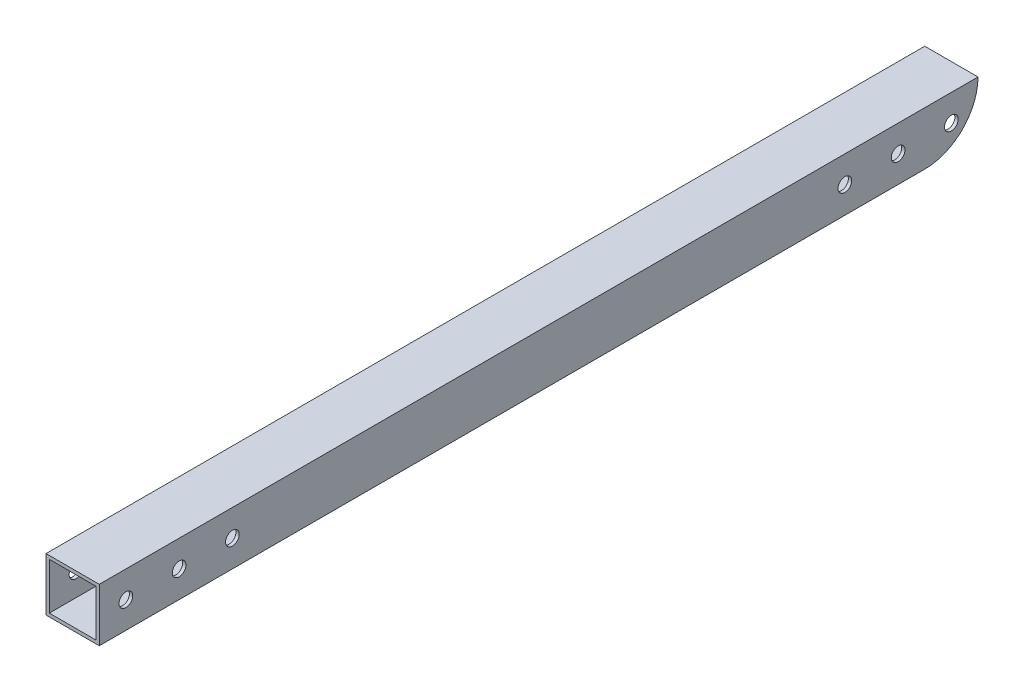
ISO-10303-21;
HEADER;
FILE_DESCRIPTION(('STEP AP214'),'2;1');
FILE_NAME('part.step','',(''),(''),'','','');
FILE_SCHEMA(('AUTOMOTIVE_DESIGN { 1 0 10303 214 1 1 1 1 }'));
ENDSEC;
DATA;
#1=APPLICATION_CONTEXT('core data for automotive mechanical design processes');
#2=APPLICATION_PROTOCOL_DEFINITION('international standard','automotive_design',2000,#1);
#3=PRODUCT_CONTEXT('',#1,'mechanical');
#4=PRODUCT('Part','Part','',(#3));
#5=PRODUCT_RELATED_PRODUCT_CATEGORY('part','',(#4));
#6=PRODUCT_DEFINITION_FORMATION('','',#4);
#7=PRODUCT_DEFINITION_CONTEXT('part definition',#1,'design');
#8=PRODUCT_DEFINITION('design','',#6,#7);
#9=PRODUCT_DEFINITION_SHAPE('','',#8);
#10=(LENGTH_UNIT() NAMED_UNIT(*) SI_UNIT(.MILLI.,.METRE.));
#11=(NAMED_UNIT(*) PLANE_ANGLE_UNIT() SI_UNIT($,.RADIAN.));
#12=(NAMED_UNIT(*) SI_UNIT($,.STERADIAN.) SOLID_ANGLE_UNIT());
#13=UNCERTAINTY_MEASURE_WITH_UNIT(LENGTH_MEASURE(1.E-05),#10,'distance_accuracy_value','');
#14=(GEOMETRIC_REPRESENTATION_CONTEXT(3) GLOBAL_UNCERTAINTY_ASSIGNED_CONTEXT((#13)) GLOBAL_UNIT_ASSIGNED_CONTEXT((#10,
#11,#12)) REPRESENTATION_CONTEXT('',''));
#15=CARTESIAN_POINT('',(0.,0.,0.));
#16=DIRECTION('',(0.,0.,1.));
#17=DIRECTION('',(1.,0.,0.));
#18=AXIS2_PLACEMENT_3D('',#15,#16,#17);
#19=CARTESIAN_POINT('',(0.,0.,419.1));
#20=DIRECTION('',(0.,1.,0.));
#21=DIRECTION('',(0.,0.,1.));
#22=AXIS2_PLACEMENT_3D('',#19,#20,#21);
#23=PLANE('',#22);
#24=DIRECTION('',(1.,0.,0.));
#25=VECTOR('',#24,1.);
#26=CARTESIAN_POINT('',(0.,0.,25.4));
#27=LINE('',#26,#25);
#28=CARTESIAN_POINT('',(0.,0.,25.4));
#29=VERTEX_POINT('',#28);
#30=CARTESIAN_POINT('',(25.4,0.,25.4));
#31=VERTEX_POINT('',#30);
#32=EDGE_CURVE('E96',#29,#31,#27,.T.);
#33=ORIENTED_EDGE('',*,*,#32,.T.);
#34=DIRECTION('',(0.,0.,-1.));
#35=VECTOR('',#34,1.);
#36=CARTESIAN_POINT('',(25.4,0.,419.1));
#37=LINE('',#36,#35);
#38=CARTESIAN_POINT('',(25.4,0.,419.1));
#39=VERTEX_POINT('',#38);
#40=EDGE_CURVE('E117',#39,#31,#37,.T.);
#41=ORIENTED_EDGE('',*,*,#40,.F.);
#42=DIRECTION('',(1.,0.,0.));
#43=VECTOR('',#42,1.);
#44=CARTESIAN_POINT('',(0.,0.,419.1));
#45=LINE('',#44,#43);
#46=CARTESIAN_POINT('',(0.,0.,419.1));
#47=VERTEX_POINT('',#46);
#48=EDGE_CURVE('E115',#47,#39,#45,.T.);
#49=ORIENTED_EDGE('',*,*,#48,.F.);
#50=DIRECTION('',(0.,0.,-1.));
#51=VECTOR('',#50,1.);
#52=CARTESIAN_POINT('',(0.,0.,419.1));
#53=LINE('',#52,#51);
#54=EDGE_CURVE('E41',#47,#29,#53,.T.);
#55=ORIENTED_EDGE('',*,*,#54,.T.);
#56=EDGE_LOOP('',(#33,#41,#49,#55));
#57=FACE_BOUND('',#56,.T.);
#58=ADVANCED_FACE('F33',(#57),#23,.F.);
#59=CARTESIAN_POINT('',(0.,0.,419.1));
#60=DIRECTION('',(0.,0.,-1.));
#61=DIRECTION('',(-1.,0.,0.));
#62=AXIS2_PLACEMENT_3D('',#59,#60,#61);
#63=PLANE('',#62);
#64=DIRECTION('',(0.,-1.,0.));
#65=VECTOR('',#64,1.);
#66=CARTESIAN_POINT('',(0.,0.,419.1));
#67=LINE('',#66,#65);
#68=CARTESIAN_POINT('',(0.,25.4,419.1));
#69=VERTEX_POINT('',#68);
#70=EDGE_CURVE('E176',#69,#47,#67,.T.);
#71=ORIENTED_EDGE('',*,*,#70,.T.);
#72=ORIENTED_EDGE('',*,*,#48,.T.);
#73=DIRECTION('',(0.,1.,0.));
#74=VECTOR('',#73,1.);
#75=CARTESIAN_POINT('',(25.4,0.,419.1));
#76=LINE('',#75,#74);
#77=CARTESIAN_POINT('',(25.4,25.4,419.1));
#78=VERTEX_POINT('',#77);
#79=EDGE_CURVE('E179',#39,#78,#76,.T.);
#80=ORIENTED_EDGE('',*,*,#79,.T.);
#81=DIRECTION('',(-1.,0.,0.));
#82=VECTOR('',#81,1.);
#83=CARTESIAN_POINT('',(0.,25.4,419.1));
#84=LINE('',#83,#82);
#85=EDGE_CURVE('E181',#78,#69,#84,.T.);
#86=ORIENTED_EDGE('',*,*,#85,.T.);
#87=EDGE_LOOP('',(#71,#72,#80,#86));
#88=FACE_BOUND('',#87,.T.);
#89=DIRECTION('',(0.,-1.,0.));
#90=VECTOR('',#89,1.);
#91=CARTESIAN_POINT('',(1.5875,23.8125,419.1));
#92=LINE('',#91,#90);
#93=CARTESIAN_POINT('',(1.5875,23.8125,419.1));
#94=VERTEX_POINT('',#93);
#95=CARTESIAN_POINT('',(1.5875,1.5875,419.1));
#96=VERTEX_POINT('',#95);
#97=EDGE_CURVE('E149',#94,#96,#92,.T.);
#98=ORIENTED_EDGE('',*,*,#97,.F.);
#99=DIRECTION('',(-1.,0.,0.));
#100=VECTOR('',#99,1.);
#101=CARTESIAN_POINT('',(1.5875,23.8125,419.1));
#102=LINE('',#101,#100);
#103=CARTESIAN_POINT('',(23.8125,23.8125,419.1));
#104=VERTEX_POINT('',#103);
#105=EDGE_CURVE('E163',#104,#94,#102,.T.);
#106=ORIENTED_EDGE('',*,*,#105,.F.);
#107=DIRECTION('',(0.,1.,0.));
#108=VECTOR('',#107,1.);
#109=CARTESIAN_POINT('',(23.8125,23.8125,419.1));
#110=LINE('',#109,#108);
#111=CARTESIAN_POINT('',(23.8125,1.5875,419.1));
#112=VERTEX_POINT('',#111);
#113=EDGE_CURVE('E161',#112,#104,#110,.T.);
#114=ORIENTED_EDGE('',*,*,#113,.F.);
#115=DIRECTION('',(1.,0.,0.));
#116=VECTOR('',#115,1.);
#117=CARTESIAN_POINT('',(1.5875,1.5875,419.1));
#118=LINE('',#117,#116);
#119=EDGE_CURVE('E159',#96,#112,#118,.T.);
#120=ORIENTED_EDGE('',*,*,#119,.F.);
#121=EDGE_LOOP('',(#98,#106,#114,#120));
#122=FACE_BOUND('',#121,.T.);
#123=ADVANCED_FACE('F263',(#88,#122),#63,.F.);
#124=CARTESIAN_POINT('',(0.,0.,419.1));
#125=DIRECTION('',(1.,0.,0.));
#126=DIRECTION('',(0.,0.,-1.));
#127=AXIS2_PLACEMENT_3D('',#124,#125,#126);
#128=PLANE('',#127);
#129=CARTESIAN_POINT('',(0.,12.7,12.7));
#130=DIRECTION('',(-1.,0.,0.));
#131=DIRECTION('',(0.,0.,1.));
#132=AXIS2_PLACEMENT_3D('',#129,#130,#131);
#133=CIRCLE('',#132,3.2639);
#134=CARTESIAN_POINT('',(0.,12.7,15.9639));
#135=VERTEX_POINT('',#134);
#136=EDGE_CURVE('E202',#135,#135,#133,.T.);
#137=ORIENTED_EDGE('',*,*,#136,.F.);
#138=EDGE_LOOP('',(#137));
#139=FACE_BOUND('',#138,.T.);
#140=CARTESIAN_POINT('',(0.,12.7,38.1));
#141=DIRECTION('',(-1.,0.,0.));
#142=DIRECTION('',(0.,0.,1.));
#143=AXIS2_PLACEMENT_3D('',#140,#141,#142);
#144=CIRCLE('',#143,3.26390000000001);
#145=CARTESIAN_POINT('',(0.,12.7,41.3639));
#146=VERTEX_POINT('',#145);
#147=EDGE_CURVE('E208',#146,#146,#144,.T.);
#148=ORIENTED_EDGE('',*,*,#147,.F.);
#149=EDGE_LOOP('',(#148));
#150=FACE_BOUND('',#149,.T.);
#151=CARTESIAN_POINT('',(0.,12.7,63.5));
#152=DIRECTION('',(-1.,0.,0.));
#153=DIRECTION('',(0.,0.,1.));
#154=AXIS2_PLACEMENT_3D('',#151,#152,#153);
#155=CIRCLE('',#154,3.26389999999999);
#156=CARTESIAN_POINT('',(0.,12.7,66.7639));
#157=VERTEX_POINT('',#156);
#158=EDGE_CURVE('E214',#157,#157,#155,.T.);
#159=ORIENTED_EDGE('',*,*,#158,.F.);
#160=EDGE_LOOP('',(#159));
#161=FACE_BOUND('',#160,.T.);
#162=CARTESIAN_POINT('',(0.,12.7,355.6));
#163=DIRECTION('',(-1.,0.,0.));
#164=DIRECTION('',(0.,0.,-1.));
#165=AXIS2_PLACEMENT_3D('',#162,#163,#164);
#166=CIRCLE('',#165,3.26390000000001);
#167=CARTESIAN_POINT('',(0.,12.7,352.3361));
#168=VERTEX_POINT('',#167);
#169=EDGE_CURVE('E220',#168,#168,#166,.T.);
#170=ORIENTED_EDGE('',*,*,#169,.F.);
#171=EDGE_LOOP('',(#170));
#172=FACE_BOUND('',#171,.T.);
#173=CARTESIAN_POINT('',(0.,12.7,381.));
#174=DIRECTION('',(-1.,0.,0.));
#175=DIRECTION('',(0.,0.,-1.));
#176=AXIS2_PLACEMENT_3D('',#173,#174,#175);
#177=CIRCLE('',#176,3.26390000000001);
#178=CARTESIAN_POINT('',(0.,12.7,377.7361));
#179=VERTEX_POINT('',#178);
#180=EDGE_CURVE('E226',#179,#179,#177,.T.);
#181=ORIENTED_EDGE('',*,*,#180,.F.);
#182=EDGE_LOOP('',(#181));
#183=FACE_BOUND('',#182,.T.);
#184=CARTESIAN_POINT('',(0.,12.7,406.4));
#185=DIRECTION('',(-1.,0.,0.));
#186=DIRECTION('',(0.,0.,-1.));
#187=AXIS2_PLACEMENT_3D('',#184,#185,#186);
#188=CIRCLE('',#187,3.26390000000001);
#189=CARTESIAN_POINT('',(0.,12.7,403.1361));
#190=VERTEX_POINT('',#189);
#191=EDGE_CURVE('E199',#190,#190,#188,.T.);
#192=ORIENTED_EDGE('',*,*,#191,.F.);
#193=EDGE_LOOP('',(#192));
#194=FACE_BOUND('',#193,.T.);
#195=DIRECTION('',(0.,0.,-1.));
#196=VECTOR('',#195,1.);
#197=CARTESIAN_POINT('',(0.,25.4,419.1));
#198=LINE('',#197,#196);
#199=CARTESIAN_POINT('',(0.,25.4,0.));
#200=VERTEX_POINT('',#199);
#201=EDGE_CURVE('E113',#69,#200,#198,.T.);
#202=ORIENTED_EDGE('',*,*,#201,.T.);
#203=CARTESIAN_POINT('',(0.,25.4,25.4));
#204=DIRECTION('',(-1.,0.,0.));
#205=DIRECTION('',(0.,0.,-1.));
#206=AXIS2_PLACEMENT_3D('',#203,#204,#205);
#207=CIRCLE('',#206,25.4);
#208=EDGE_CURVE('E99',#200,#29,#207,.T.);
#209=ORIENTED_EDGE('',*,*,#208,.T.);
#210=ORIENTED_EDGE('',*,*,#54,.F.);
#211=ORIENTED_EDGE('',*,*,#70,.F.);
#212=EDGE_LOOP('',(#202,#209,#210,#211));
#213=FACE_BOUND('',#212,.T.);
#214=ADVANCED_FACE('F35',(#139,#150,#161,#172,#183,#194,#213),#128,.F.);
#215=CARTESIAN_POINT('',(25.4,0.,419.1));
#216=DIRECTION('',(-1.,0.,0.));
#217=DIRECTION('',(0.,0.,1.));
#218=AXIS2_PLACEMENT_3D('',#215,#216,#217);
#219=PLANE('',#218);
#220=CARTESIAN_POINT('',(25.4,12.7,12.7));
#221=DIRECTION('',(-1.,0.,0.));
#222=DIRECTION('',(0.,0.,1.));
#223=AXIS2_PLACEMENT_3D('',#220,#221,#222);
#224=CIRCLE('',#223,3.2639);
#225=CARTESIAN_POINT('',(25.4,12.7,15.9639));
#226=VERTEX_POINT('',#225);
#227=EDGE_CURVE('E127',#226,#226,#224,.T.);
#228=ORIENTED_EDGE('',*,*,#227,.T.);
#229=EDGE_LOOP('',(#228));
#230=FACE_BOUND('',#229,.T.);
#231=CARTESIAN_POINT('',(25.4,12.7,38.1));
#232=DIRECTION('',(-1.,0.,0.));
#233=DIRECTION('',(0.,0.,1.));
#234=AXIS2_PLACEMENT_3D('',#231,#232,#233);
#235=CIRCLE('',#234,3.26390000000001);
#236=CARTESIAN_POINT('',(25.4,12.7,41.3639));
#237=VERTEX_POINT('',#236);
#238=EDGE_CURVE('E205',#237,#237,#235,.T.);
#239=ORIENTED_EDGE('',*,*,#238,.T.);
#240=EDGE_LOOP('',(#239));
#241=FACE_BOUND('',#240,.T.);
#242=CARTESIAN_POINT('',(25.4,12.7,63.5));
#243=DIRECTION('',(-1.,0.,0.));
#244=DIRECTION('',(0.,0.,1.));
#245=AXIS2_PLACEMENT_3D('',#242,#243,#244);
#246=CIRCLE('',#245,3.26389999999999);
#247=CARTESIAN_POINT('',(25.4,12.7,66.7639));
#248=VERTEX_POINT('',#247);
#249=EDGE_CURVE('E211',#248,#248,#246,.T.);
#250=ORIENTED_EDGE('',*,*,#249,.T.);
#251=EDGE_LOOP('',(#250));
#252=FACE_BOUND('',#251,.T.);
#253=CARTESIAN_POINT('',(25.4,12.7,355.6));
#254=DIRECTION('',(-1.,0.,0.));
#255=DIRECTION('',(0.,0.,-1.));
#256=AXIS2_PLACEMENT_3D('',#253,#254,#255);
#257=CIRCLE('',#256,3.26390000000001);
#258=CARTESIAN_POINT('',(25.4,12.7,352.3361));
#259=VERTEX_POINT('',#258);
#260=EDGE_CURVE('E217',#259,#259,#257,.T.);
#261=ORIENTED_EDGE('',*,*,#260,.T.);
#262=EDGE_LOOP('',(#261));
#263=FACE_BOUND('',#262,.T.);
#264=CARTESIAN_POINT('',(25.4,12.7,381.));
#265=DIRECTION('',(-1.,0.,0.));
#266=DIRECTION('',(0.,0.,-1.));
#267=AXIS2_PLACEMENT_3D('',#264,#265,#266);
#268=CIRCLE('',#267,3.26390000000001);
#269=CARTESIAN_POINT('',(25.4,12.7,377.7361));
#270=VERTEX_POINT('',#269);
#271=EDGE_CURVE('E223',#270,#270,#268,.T.);
#272=ORIENTED_EDGE('',*,*,#271,.T.);
#273=EDGE_LOOP('',(#272));
#274=FACE_BOUND('',#273,.T.);
#275=CARTESIAN_POINT('',(25.4,12.7,406.4));
#276=DIRECTION('',(-1.,0.,0.));
#277=DIRECTION('',(0.,0.,-1.));
#278=AXIS2_PLACEMENT_3D('',#275,#276,#277);
#279=CIRCLE('',#278,3.26390000000001);
#280=CARTESIAN_POINT('',(25.4,12.7,403.1361));
#281=VERTEX_POINT('',#280);
#282=EDGE_CURVE('E229',#281,#281,#279,.T.);
#283=ORIENTED_EDGE('',*,*,#282,.T.);
#284=EDGE_LOOP('',(#283));
#285=FACE_BOUND('',#284,.T.);
#286=ORIENTED_EDGE('',*,*,#40,.T.);
#287=CARTESIAN_POINT('',(25.4,25.4,25.4));
#288=DIRECTION('',(-1.,0.,0.));
#289=DIRECTION('',(0.,0.,-1.));
#290=AXIS2_PLACEMENT_3D('',#287,#288,#289);
#291=CIRCLE('',#290,25.4);
#292=CARTESIAN_POINT('',(25.4,25.4,0.));
#293=VERTEX_POINT('',#292);
#294=EDGE_CURVE('E102',#293,#31,#291,.T.);
#295=ORIENTED_EDGE('',*,*,#294,.F.);
#296=DIRECTION('',(0.,0.,-1.));
#297=VECTOR('',#296,1.);
#298=CARTESIAN_POINT('',(25.4,25.4,419.1));
#299=LINE('',#298,#297);
#300=EDGE_CURVE('E119',#78,#293,#299,.T.);
#301=ORIENTED_EDGE('',*,*,#300,.F.);
#302=ORIENTED_EDGE('',*,*,#79,.F.);
#303=EDGE_LOOP('',(#286,#295,#301,#302));
#304=FACE_BOUND('',#303,.T.);
#305=ADVANCED_FACE('F191',(#230,#241,#252,#263,#274,#285,#304),#219,.F.);
#306=CARTESIAN_POINT('',(0.,25.4,419.1));
#307=DIRECTION('',(0.,-1.,0.));
#308=DIRECTION('',(0.,0.,-1.));
#309=AXIS2_PLACEMENT_3D('',#306,#307,#308);
#310=PLANE('',#309);
#311=DIRECTION('',(-1.,0.,0.));
#312=VECTOR('',#311,1.);
#313=CARTESIAN_POINT('',(0.,25.4,0.));
#314=LINE('',#313,#312);
#315=EDGE_CURVE('E175',#293,#200,#314,.T.);
#316=ORIENTED_EDGE('',*,*,#315,.T.);
#317=ORIENTED_EDGE('',*,*,#201,.F.);
#318=ORIENTED_EDGE('',*,*,#85,.F.);
#319=ORIENTED_EDGE('',*,*,#300,.T.);
#320=EDGE_LOOP('',(#316,#317,#318,#319));
#321=FACE_BOUND('',#320,.T.);
#322=ADVANCED_FACE('F188',(#321),#310,.F.);
#323=CARTESIAN_POINT('',(1.5875,23.8125,419.1));
#324=DIRECTION('',(1.,0.,0.));
#325=DIRECTION('',(0.,1.,0.));
#326=AXIS2_PLACEMENT_3D('',#323,#324,#325);
#327=PLANE('',#326);
#328=CARTESIAN_POINT('',(1.5875,25.4,25.4));
#329=DIRECTION('',(1.,0.,0.));
#330=DIRECTION('',(0.,1.,0.));
#331=AXIS2_PLACEMENT_3D('',#328,#329,#330);
#332=CIRCLE('',#331,25.4);
#333=CARTESIAN_POINT('',(1.5875,23.8125,0.0496579165092936));
#334=VERTEX_POINT('',#333);
#335=CARTESIAN_POINT('',(1.5875,1.5875,16.5611740740073));
#336=VERTEX_POINT('',#335);
#337=EDGE_CURVE('E197',#334,#336,#332,.F.);
#338=ORIENTED_EDGE('',*,*,#337,.F.);
#339=DIRECTION('',(0.,0.,-1.));
#340=VECTOR('',#339,1.);
#341=CARTESIAN_POINT('',(1.5875,23.8125,419.1));
#342=LINE('',#341,#340);
#343=EDGE_CURVE('E165',#94,#334,#342,.T.);
#344=ORIENTED_EDGE('',*,*,#343,.F.);
#345=ORIENTED_EDGE('',*,*,#97,.T.);
#346=DIRECTION('',(0.,0.,-1.));
#347=VECTOR('',#346,1.);
#348=CARTESIAN_POINT('',(1.5875,1.5875,419.1));
#349=LINE('',#348,#347);
#350=EDGE_CURVE('E172',#96,#336,#349,.T.);
#351=ORIENTED_EDGE('',*,*,#350,.T.);
#352=EDGE_LOOP('',(#338,#344,#345,#351));
#353=FACE_BOUND('',#352,.T.);
#354=CARTESIAN_POINT('',(1.5875,12.7,12.7));
#355=DIRECTION('',(1.,0.,0.));
#356=DIRECTION('',(0.,1.,0.));
#357=AXIS2_PLACEMENT_3D('',#354,#355,#356);
#358=CIRCLE('',#357,3.2639);
#359=CARTESIAN_POINT('',(1.5875,15.9639,12.7));
#360=VERTEX_POINT('',#359);
#361=EDGE_CURVE('E145',#360,#360,#358,.T.);
#362=ORIENTED_EDGE('',*,*,#361,.F.);
#363=EDGE_LOOP('',(#362));
#364=FACE_BOUND('',#363,.T.);
#365=CARTESIAN_POINT('',(1.5875,12.7,38.1));
#366=DIRECTION('',(1.,0.,0.));
#367=DIRECTION('',(0.,1.,0.));
#368=AXIS2_PLACEMENT_3D('',#365,#366,#367);
#369=CIRCLE('',#368,3.26390000000001);
#370=CARTESIAN_POINT('',(1.5875,15.9639,38.1));
#371=VERTEX_POINT('',#370);
#372=EDGE_CURVE('E142',#371,#371,#369,.T.);
#373=ORIENTED_EDGE('',*,*,#372,.F.);
#374=EDGE_LOOP('',(#373));
#375=FACE_BOUND('',#374,.T.);
#376=CARTESIAN_POINT('',(1.5875,12.7,63.5));
#377=DIRECTION('',(1.,0.,0.));
#378=DIRECTION('',(0.,1.,0.));
#379=AXIS2_PLACEMENT_3D('',#376,#377,#378);
#380=CIRCLE('',#379,3.26389999999999);
#381=CARTESIAN_POINT('',(1.5875,15.9639,63.5));
#382=VERTEX_POINT('',#381);
#383=EDGE_CURVE('E139',#382,#382,#380,.T.);
#384=ORIENTED_EDGE('',*,*,#383,.F.);
#385=EDGE_LOOP('',(#384));
#386=FACE_BOUND('',#385,.T.);
#387=CARTESIAN_POINT('',(1.5875,12.7,355.6));
#388=DIRECTION('',(1.,0.,0.));
#389=DIRECTION('',(0.,1.,0.));
#390=AXIS2_PLACEMENT_3D('',#387,#388,#389);
#391=CIRCLE('',#390,3.26390000000001);
#392=CARTESIAN_POINT('',(1.5875,15.9639,355.6));
#393=VERTEX_POINT('',#392);
#394=EDGE_CURVE('E135',#393,#393,#391,.T.);
#395=ORIENTED_EDGE('',*,*,#394,.F.);
#396=EDGE_LOOP('',(#395));
#397=FACE_BOUND('',#396,.T.);
#398=CARTESIAN_POINT('',(1.5875,12.7,381.));
#399=DIRECTION('',(1.,0.,0.));
#400=DIRECTION('',(0.,1.,0.));
#401=AXIS2_PLACEMENT_3D('',#398,#399,#400);
#402=CIRCLE('',#401,3.26390000000001);
#403=CARTESIAN_POINT('',(1.5875,15.9639,381.));
#404=VERTEX_POINT('',#403);
#405=EDGE_CURVE('E131',#404,#404,#402,.T.);
#406=ORIENTED_EDGE('',*,*,#405,.F.);
#407=EDGE_LOOP('',(#406));
#408=FACE_BOUND('',#407,.T.);
#409=CARTESIAN_POINT('',(1.5875,12.7,406.4));
#410=DIRECTION('',(1.,0.,0.));
#411=DIRECTION('',(0.,1.,0.));
#412=AXIS2_PLACEMENT_3D('',#409,#410,#411);
#413=CIRCLE('',#412,3.26390000000001);
#414=CARTESIAN_POINT('',(1.5875,15.9639,406.4));
#415=VERTEX_POINT('',#414);
#416=EDGE_CURVE('E126',#415,#415,#413,.T.);
#417=ORIENTED_EDGE('',*,*,#416,.F.);
#418=EDGE_LOOP('',(#417));
#419=FACE_BOUND('',#418,.T.);
#420=ADVANCED_FACE('F243',(#353,#364,#375,#386,#397,#408,#419),#327,.T.);
#421=CARTESIAN_POINT('',(1.5875,1.5875,419.1));
#422=DIRECTION('',(0.,1.,0.));
#423=DIRECTION('',(0.,0.,1.));
#424=AXIS2_PLACEMENT_3D('',#421,#422,#423);
#425=PLANE('',#424);
#426=DIRECTION('',(1.,0.,0.));
#427=VECTOR('',#426,1.);
#428=CARTESIAN_POINT('',(0.,1.5875,16.5611740740073));
#429=LINE('',#428,#427);
#430=CARTESIAN_POINT('',(23.8125,1.5875,16.5611740740073));
#431=VERTEX_POINT('',#430);
#432=EDGE_CURVE('E195',#336,#431,#429,.T.);
#433=ORIENTED_EDGE('',*,*,#432,.F.);
#434=ORIENTED_EDGE('',*,*,#350,.F.);
#435=ORIENTED_EDGE('',*,*,#119,.T.);
#436=DIRECTION('',(0.,0.,-1.));
#437=VECTOR('',#436,1.);
#438=CARTESIAN_POINT('',(23.8125,1.5875,419.1));
#439=LINE('',#438,#437);
#440=EDGE_CURVE('E169',#112,#431,#439,.T.);
#441=ORIENTED_EDGE('',*,*,#440,.T.);
#442=EDGE_LOOP('',(#433,#434,#435,#441));
#443=FACE_BOUND('',#442,.T.);
#444=ADVANCED_FACE('F246',(#443),#425,.T.);
#445=CARTESIAN_POINT('',(23.8125,23.8125,419.1));
#446=DIRECTION('',(-1.,0.,0.));
#447=DIRECTION('',(0.,-1.,0.));
#448=AXIS2_PLACEMENT_3D('',#445,#446,#447);
#449=PLANE('',#448);
#450=CARTESIAN_POINT('',(23.8125,25.4,25.4));
#451=DIRECTION('',(-1.,0.,0.));
#452=DIRECTION('',(0.,-1.,0.));
#453=AXIS2_PLACEMENT_3D('',#450,#451,#452);
#454=CIRCLE('',#453,25.4);
#455=CARTESIAN_POINT('',(23.8125,23.8125,0.0496579165092936));
#456=VERTEX_POINT('',#455);
#457=EDGE_CURVE('E47',#431,#456,#454,.F.);
#458=ORIENTED_EDGE('',*,*,#457,.F.);
#459=ORIENTED_EDGE('',*,*,#440,.F.);
#460=ORIENTED_EDGE('',*,*,#113,.T.);
#461=DIRECTION('',(0.,0.,-1.));
#462=VECTOR('',#461,1.);
#463=CARTESIAN_POINT('',(23.8125,23.8125,419.1));
#464=LINE('',#463,#462);
#465=EDGE_CURVE('E54',#104,#456,#464,.T.);
#466=ORIENTED_EDGE('',*,*,#465,.T.);
#467=EDGE_LOOP('',(#458,#459,#460,#466));
#468=FACE_BOUND('',#467,.T.);
#469=CARTESIAN_POINT('',(23.8125,12.7,12.7));
#470=DIRECTION('',(-1.,0.,0.));
#471=DIRECTION('',(0.,-1.,0.));
#472=AXIS2_PLACEMENT_3D('',#469,#470,#471);
#473=CIRCLE('',#472,3.2639);
#474=CARTESIAN_POINT('',(23.8125,9.4361,12.7));
#475=VERTEX_POINT('',#474);
#476=EDGE_CURVE('E143',#475,#475,#473,.T.);
#477=ORIENTED_EDGE('',*,*,#476,.F.);
#478=EDGE_LOOP('',(#477));
#479=FACE_BOUND('',#478,.T.);
#480=CARTESIAN_POINT('',(23.8125,12.7,38.1));
#481=DIRECTION('',(-1.,0.,0.));
#482=DIRECTION('',(0.,-1.,0.));
#483=AXIS2_PLACEMENT_3D('',#480,#481,#482);
#484=CIRCLE('',#483,3.26390000000001);
#485=CARTESIAN_POINT('',(23.8125,9.43609999999999,38.1));
#486=VERTEX_POINT('',#485);
#487=EDGE_CURVE('E140',#486,#486,#484,.T.);
#488=ORIENTED_EDGE('',*,*,#487,.F.);
#489=EDGE_LOOP('',(#488));
#490=FACE_BOUND('',#489,.T.);
#491=CARTESIAN_POINT('',(23.8125,12.7,63.5));
#492=DIRECTION('',(-1.,0.,0.));
#493=DIRECTION('',(0.,-1.,0.));
#494=AXIS2_PLACEMENT_3D('',#491,#492,#493);
#495=CIRCLE('',#494,3.26389999999999);
#496=CARTESIAN_POINT('',(23.8125,9.43610000000001,63.5));
#497=VERTEX_POINT('',#496);
#498=EDGE_CURVE('E136',#497,#497,#495,.T.);
#499=ORIENTED_EDGE('',*,*,#498,.F.);
#500=EDGE_LOOP('',(#499));
#501=FACE_BOUND('',#500,.T.);
#502=CARTESIAN_POINT('',(23.8125,12.7,355.6));
#503=DIRECTION('',(-1.,0.,0.));
#504=DIRECTION('',(0.,-1.,0.));
#505=AXIS2_PLACEMENT_3D('',#502,#503,#504);
#506=CIRCLE('',#505,3.26390000000001);
#507=CARTESIAN_POINT('',(23.8125,9.43609999999995,355.6));
#508=VERTEX_POINT('',#507);
#509=EDGE_CURVE('E132',#508,#508,#506,.T.);
#510=ORIENTED_EDGE('',*,*,#509,.F.);
#511=EDGE_LOOP('',(#510));
#512=FACE_BOUND('',#511,.T.);
#513=CARTESIAN_POINT('',(23.8125,12.7,381.));
#514=DIRECTION('',(-1.,0.,0.));
#515=DIRECTION('',(0.,-1.,0.));
#516=AXIS2_PLACEMENT_3D('',#513,#514,#515);
#517=CIRCLE('',#516,3.26390000000001);
#518=CARTESIAN_POINT('',(23.8125,9.43609999999996,381.));
#519=VERTEX_POINT('',#518);
#520=EDGE_CURVE('E128',#519,#519,#517,.T.);
#521=ORIENTED_EDGE('',*,*,#520,.F.);
#522=EDGE_LOOP('',(#521));
#523=FACE_BOUND('',#522,.T.);
#524=CARTESIAN_POINT('',(23.8125,12.7,406.4));
#525=DIRECTION('',(-1.,0.,0.));
#526=DIRECTION('',(0.,-1.,0.));
#527=AXIS2_PLACEMENT_3D('',#524,#525,#526);
#528=CIRCLE('',#527,3.26390000000001);
#529=CARTESIAN_POINT('',(23.8125,9.43609999999997,406.4));
#530=VERTEX_POINT('',#529);
#531=EDGE_CURVE('E123',#530,#530,#528,.T.);
#532=ORIENTED_EDGE('',*,*,#531,.F.);
#533=EDGE_LOOP('',(#532));
#534=FACE_BOUND('',#533,.T.);
#535=ADVANCED_FACE('F283',(#468,#479,#490,#501,#512,#523,#534),#449,.T.);
#536=CARTESIAN_POINT('',(1.5875,23.8125,419.1));
#537=DIRECTION('',(0.,-1.,0.));
#538=DIRECTION('',(0.,0.,-1.));
#539=AXIS2_PLACEMENT_3D('',#536,#537,#538);
#540=PLANE('',#539);
#541=DIRECTION('',(1.,0.,0.));
#542=VECTOR('',#541,1.);
#543=CARTESIAN_POINT('',(0.,23.8125,0.0496579165092936));
#544=LINE('',#543,#542);
#545=EDGE_CURVE('E11',#456,#334,#544,.F.);
#546=ORIENTED_EDGE('',*,*,#545,.F.);
#547=ORIENTED_EDGE('',*,*,#465,.F.);
#548=ORIENTED_EDGE('',*,*,#105,.T.);
#549=ORIENTED_EDGE('',*,*,#343,.T.);
#550=EDGE_LOOP('',(#546,#547,#548,#549));
#551=FACE_BOUND('',#550,.T.);
#552=ADVANCED_FACE('F287',(#551),#540,.T.);
#553=CARTESIAN_POINT('',(25.4,12.7,406.4));
#554=DIRECTION('',(-1.,0.,0.));
#555=DIRECTION('',(0.,0.,1.));
#556=AXIS2_PLACEMENT_3D('',#553,#554,#555);
#557=CYLINDRICAL_SURFACE('',#556,3.26390000000001);
#558=ORIENTED_EDGE('',*,*,#531,.T.);
#559=EDGE_LOOP('',(#558));
#560=FACE_BOUND('',#559,.T.);
#561=ORIENTED_EDGE('',*,*,#282,.F.);
#562=EDGE_LOOP('',(#561));
#563=FACE_BOUND('',#562,.T.);
#564=ADVANCED_FACE('F259',(#560,#563),#557,.F.);
#565=CARTESIAN_POINT('',(25.4,12.7,381.));
#566=DIRECTION('',(-1.,0.,0.));
#567=DIRECTION('',(0.,0.,1.));
#568=AXIS2_PLACEMENT_3D('',#565,#566,#567);
#569=CYLINDRICAL_SURFACE('',#568,3.26390000000001);
#570=ORIENTED_EDGE('',*,*,#520,.T.);
#571=EDGE_LOOP('',(#570));
#572=FACE_BOUND('',#571,.T.);
#573=ORIENTED_EDGE('',*,*,#271,.F.);
#574=EDGE_LOOP('',(#573));
#575=FACE_BOUND('',#574,.T.);
#576=ADVANCED_FACE('F292',(#572,#575),#569,.F.);
#577=CARTESIAN_POINT('',(25.4,12.7,355.6));
#578=DIRECTION('',(-1.,0.,0.));
#579=DIRECTION('',(0.,0.,1.));
#580=AXIS2_PLACEMENT_3D('',#577,#578,#579);
#581=CYLINDRICAL_SURFACE('',#580,3.26390000000001);
#582=ORIENTED_EDGE('',*,*,#509,.T.);
#583=EDGE_LOOP('',(#582));
#584=FACE_BOUND('',#583,.T.);
#585=ORIENTED_EDGE('',*,*,#260,.F.);
#586=EDGE_LOOP('',(#585));
#587=FACE_BOUND('',#586,.T.);
#588=ADVANCED_FACE('F296',(#584,#587),#581,.F.);
#589=CARTESIAN_POINT('',(25.4,12.7,63.5));
#590=DIRECTION('',(-1.,0.,0.));
#591=DIRECTION('',(0.,0.,1.));
#592=AXIS2_PLACEMENT_3D('',#589,#590,#591);
#593=CYLINDRICAL_SURFACE('',#592,3.26389999999999);
#594=ORIENTED_EDGE('',*,*,#498,.T.);
#595=EDGE_LOOP('',(#594));
#596=FACE_BOUND('',#595,.T.);
#597=ORIENTED_EDGE('',*,*,#249,.F.);
#598=EDGE_LOOP('',(#597));
#599=FACE_BOUND('',#598,.T.);
#600=ADVANCED_FACE('F300',(#596,#599),#593,.F.);
#601=CARTESIAN_POINT('',(25.4,12.7,38.1));
#602=DIRECTION('',(-1.,0.,0.));
#603=DIRECTION('',(0.,0.,1.));
#604=AXIS2_PLACEMENT_3D('',#601,#602,#603);
#605=CYLINDRICAL_SURFACE('',#604,3.26390000000001);
#606=ORIENTED_EDGE('',*,*,#487,.T.);
#607=EDGE_LOOP('',(#606));
#608=FACE_BOUND('',#607,.T.);
#609=ORIENTED_EDGE('',*,*,#238,.F.);
#610=EDGE_LOOP('',(#609));
#611=FACE_BOUND('',#610,.T.);
#612=ADVANCED_FACE('F304',(#608,#611),#605,.F.);
#613=CARTESIAN_POINT('',(25.4,12.7,12.7));
#614=DIRECTION('',(-1.,0.,0.));
#615=DIRECTION('',(0.,0.,1.));
#616=AXIS2_PLACEMENT_3D('',#613,#614,#615);
#617=CYLINDRICAL_SURFACE('',#616,3.2639);
#618=ORIENTED_EDGE('',*,*,#476,.T.);
#619=EDGE_LOOP('',(#618));
#620=FACE_BOUND('',#619,.T.);
#621=ORIENTED_EDGE('',*,*,#227,.F.);
#622=EDGE_LOOP('',(#621));
#623=FACE_BOUND('',#622,.T.);
#624=ADVANCED_FACE('F257',(#620,#623),#617,.F.);
#625=ORIENTED_EDGE('',*,*,#416,.T.);
#626=EDGE_LOOP('',(#625));
#627=FACE_BOUND('',#626,.T.);
#628=ORIENTED_EDGE('',*,*,#191,.T.);
#629=EDGE_LOOP('',(#628));
#630=FACE_BOUND('',#629,.T.);
#631=ADVANCED_FACE('F253',(#627,#630),#557,.F.);
#632=ORIENTED_EDGE('',*,*,#405,.T.);
#633=EDGE_LOOP('',(#632));
#634=FACE_BOUND('',#633,.T.);
#635=ORIENTED_EDGE('',*,*,#180,.T.);
#636=EDGE_LOOP('',(#635));
#637=FACE_BOUND('',#636,.T.);
#638=ADVANCED_FACE('F256',(#634,#637),#569,.F.);
#639=ORIENTED_EDGE('',*,*,#394,.T.);
#640=EDGE_LOOP('',(#639));
#641=FACE_BOUND('',#640,.T.);
#642=ORIENTED_EDGE('',*,*,#169,.T.);
#643=EDGE_LOOP('',(#642));
#644=FACE_BOUND('',#643,.T.);
#645=ADVANCED_FACE('F240',(#641,#644),#581,.F.);
#646=ORIENTED_EDGE('',*,*,#383,.T.);
#647=EDGE_LOOP('',(#646));
#648=FACE_BOUND('',#647,.T.);
#649=ORIENTED_EDGE('',*,*,#158,.T.);
#650=EDGE_LOOP('',(#649));
#651=FACE_BOUND('',#650,.T.);
#652=ADVANCED_FACE('F306',(#648,#651),#593,.F.);
#653=ORIENTED_EDGE('',*,*,#372,.T.);
#654=EDGE_LOOP('',(#653));
#655=FACE_BOUND('',#654,.T.);
#656=ORIENTED_EDGE('',*,*,#147,.T.);
#657=EDGE_LOOP('',(#656));
#658=FACE_BOUND('',#657,.T.);
#659=ADVANCED_FACE('F310',(#655,#658),#605,.F.);
#660=ORIENTED_EDGE('',*,*,#361,.T.);
#661=EDGE_LOOP('',(#660));
#662=FACE_BOUND('',#661,.T.);
#663=ORIENTED_EDGE('',*,*,#136,.T.);
#664=EDGE_LOOP('',(#663));
#665=FACE_BOUND('',#664,.T.);
#666=ADVANCED_FACE('F313',(#662,#665),#617,.F.);
#667=CARTESIAN_POINT('',(0.,25.4,25.4));
#668=DIRECTION('',(1.,0.,0.));
#669=DIRECTION('',(0.,0.,-1.));
#670=AXIS2_PLACEMENT_3D('',#667,#668,#669);
#671=CYLINDRICAL_SURFACE('',#670,25.4);
#672=ORIENTED_EDGE('',*,*,#337,.T.);
#673=ORIENTED_EDGE('',*,*,#432,.T.);
#674=ORIENTED_EDGE('',*,*,#457,.T.);
#675=ORIENTED_EDGE('',*,*,#545,.T.);
#676=EDGE_LOOP('',(#672,#673,#674,#675));
#677=FACE_BOUND('',#676,.T.);
#678=ORIENTED_EDGE('',*,*,#294,.T.);
#679=ORIENTED_EDGE('',*,*,#32,.F.);
#680=ORIENTED_EDGE('',*,*,#208,.F.);
#681=ORIENTED_EDGE('',*,*,#315,.F.);
#682=EDGE_LOOP('',(#678,#679,#680,#681));
#683=FACE_BOUND('',#682,.T.);
#684=ADVANCED_FACE('F98',(#677,#683),#671,.T.);
#685=CLOSED_SHELL('',(#58,#123,#214,#305,#322,#420,#444,#535,#552,#564,#576,#588,#600,#612,#624,
#631,#638,#645,#652,#659,#666,#684));
#686=MANIFOLD_SOLID_BREP('B2',#685);
#687=ADVANCED_BREP_SHAPE_REPRESENTATION('',(#18,#686),#14);
#688=SHAPE_DEFINITION_REPRESENTATION(#9,#687);
ENDSEC;
END-ISO-10303-21;
